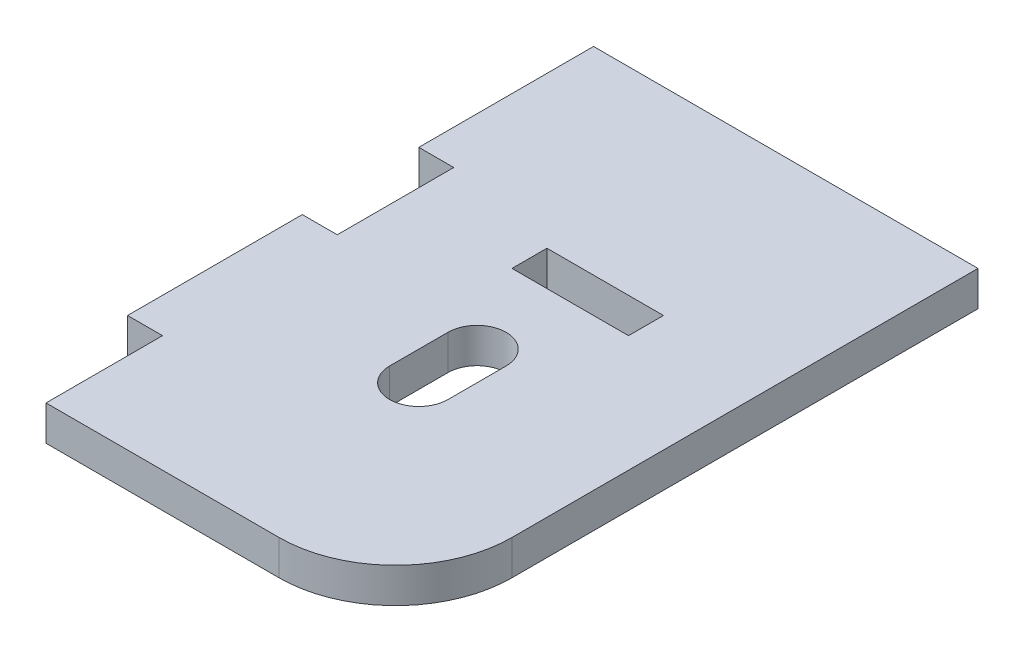
ISO-10303-21;
HEADER;
FILE_DESCRIPTION(('STEP AP214'),'2;1');
FILE_NAME('part.step','',(''),(''),'','','');
FILE_SCHEMA(('AUTOMOTIVE_DESIGN { 1 0 10303 214 1 1 1 1 }'));
ENDSEC;
DATA;
#1=APPLICATION_CONTEXT('core data for automotive mechanical design processes');
#2=APPLICATION_PROTOCOL_DEFINITION('international standard','automotive_design',2000,#1);
#3=PRODUCT_CONTEXT('',#1,'mechanical');
#4=PRODUCT('Part','Part','',(#3));
#5=PRODUCT_RELATED_PRODUCT_CATEGORY('part','',(#4));
#6=PRODUCT_DEFINITION_FORMATION('','',#4);
#7=PRODUCT_DEFINITION_CONTEXT('part definition',#1,'design');
#8=PRODUCT_DEFINITION('design','',#6,#7);
#9=PRODUCT_DEFINITION_SHAPE('','',#8);
#10=(LENGTH_UNIT() NAMED_UNIT(*) SI_UNIT(.MILLI.,.METRE.));
#11=(NAMED_UNIT(*) PLANE_ANGLE_UNIT() SI_UNIT($,.RADIAN.));
#12=(NAMED_UNIT(*) SI_UNIT($,.STERADIAN.) SOLID_ANGLE_UNIT());
#13=UNCERTAINTY_MEASURE_WITH_UNIT(LENGTH_MEASURE(1.E-05),#10,'distance_accuracy_value','');
#14=(GEOMETRIC_REPRESENTATION_CONTEXT(3) GLOBAL_UNCERTAINTY_ASSIGNED_CONTEXT((#13)) GLOBAL_UNIT_ASSIGNED_CONTEXT((#10,
#11,#12)) REPRESENTATION_CONTEXT('',''));
#15=CARTESIAN_POINT('',(0.,0.,0.));
#16=DIRECTION('',(0.,0.,1.));
#17=DIRECTION('',(1.,0.,0.));
#18=AXIS2_PLACEMENT_3D('',#15,#16,#17);
#19=CARTESIAN_POINT('',(0.,3.,0.));
#20=DIRECTION('',(0.,1.,0.));
#21=DIRECTION('',(0.,0.,1.00000000000001));
#22=AXIS2_PLACEMENT_3D('',#19,#20,#21);
#23=PLANE('',#22);
#24=CARTESIAN_POINT('',(-15.5000000000001,3.,32.5));
#25=DIRECTION('',(0.,1.,0.));
#26=DIRECTION('',(0.,0.,1.00000000000001));
#27=AXIS2_PLACEMENT_3D('',#24,#25,#26);
#28=CIRCLE('',#27,2.5);
#29=CARTESIAN_POINT('',(-18.,3.,32.5));
#30=VERTEX_POINT('',#29);
#31=CARTESIAN_POINT('',(-13.,3.,32.5000000000013));
#32=VERTEX_POINT('',#31);
#33=EDGE_CURVE('E170',#30,#32,#28,.T.);
#34=ORIENTED_EDGE('',*,*,#33,.F.);
#35=DIRECTION('',(0.,0.,1.00000000000001));
#36=VECTOR('',#35,1.);
#37=CARTESIAN_POINT('',(-18.,3.,32.5));
#38=LINE('',#37,#36);
#39=CARTESIAN_POINT('',(-18.,3.,27.4999999999999));
#40=VERTEX_POINT('',#39);
#41=EDGE_CURVE('E187',#40,#30,#38,.T.);
#42=ORIENTED_EDGE('',*,*,#41,.F.);
#43=CARTESIAN_POINT('',(-15.5000000000001,3.,27.4999999999999));
#44=DIRECTION('',(0.,1.,0.));
#45=DIRECTION('',(0.,0.,1.00000000000001));
#46=AXIS2_PLACEMENT_3D('',#43,#44,#45);
#47=CIRCLE('',#46,2.5);
#48=CARTESIAN_POINT('',(-13.,3.,27.500000000001));
#49=VERTEX_POINT('',#48);
#50=EDGE_CURVE('E190',#49,#40,#47,.T.);
#51=ORIENTED_EDGE('',*,*,#50,.F.);
#52=DIRECTION('',(0.,0.,-1.00000000000001));
#53=VECTOR('',#52,1.);
#54=CARTESIAN_POINT('',(-13.,3.,32.5000000000013));
#55=LINE('',#54,#53);
#56=EDGE_CURVE('E196',#32,#49,#55,.T.);
#57=ORIENTED_EDGE('',*,*,#56,.F.);
#58=EDGE_LOOP('',(#34,#42,#51,#57));
#59=FACE_BOUND('',#58,.T.);
#60=DIRECTION('',(1.00000000000001,0.,0.));
#61=VECTOR('',#60,1.);
#62=CARTESIAN_POINT('',(-30.0000000000003,3.,50.0000000000005));
#63=LINE('',#62,#61);
#64=CARTESIAN_POINT('',(-30.0000000000003,3.,50.0000000000005));
#65=VERTEX_POINT('',#64);
#66=CARTESIAN_POINT('',(-10.,3.,50.0000000000012));
#67=VERTEX_POINT('',#66);
#68=EDGE_CURVE('E255',#65,#67,#63,.T.);
#69=ORIENTED_EDGE('',*,*,#68,.T.);
#70=CARTESIAN_POINT('',(-10.,3.,40.0000000000012));
#71=DIRECTION('',(0.,1.,0.));
#72=DIRECTION('',(0.,0.,1.00000000000001));
#73=AXIS2_PLACEMENT_3D('',#70,#71,#72);
#74=CIRCLE('',#73,10.);
#75=CARTESIAN_POINT('',(0.,3.,40.0000000000001));
#76=VERTEX_POINT('',#75);
#77=EDGE_CURVE('E11',#67,#76,#74,.T.);
#78=ORIENTED_EDGE('',*,*,#77,.T.);
#79=DIRECTION('',(0.,0.,-1.00000000000001));
#80=VECTOR('',#79,1.);
#81=CARTESIAN_POINT('',(0.,3.,50.0000000000001));
#82=LINE('',#81,#80);
#83=CARTESIAN_POINT('',(0.,3.,0.));
#84=VERTEX_POINT('',#83);
#85=EDGE_CURVE('E257',#76,#84,#82,.T.);
#86=ORIENTED_EDGE('',*,*,#85,.T.);
#87=DIRECTION('',(-1.00000000000001,0.,0.));
#88=VECTOR('',#87,1.);
#89=CARTESIAN_POINT('',(0.,3.,0.));
#90=LINE('',#89,#88);
#91=CARTESIAN_POINT('',(-33.0000000000002,3.,0.));
#92=VERTEX_POINT('',#91);
#93=EDGE_CURVE('E237',#84,#92,#90,.T.);
#94=ORIENTED_EDGE('',*,*,#93,.T.);
#95=DIRECTION('',(0.,0.,1.00000000000001));
#96=VECTOR('',#95,1.);
#97=CARTESIAN_POINT('',(-33.0000000000002,3.,0.));
#98=LINE('',#97,#96);
#99=CARTESIAN_POINT('',(-33.0000000000003,3.,15.0000000000002));
#100=VERTEX_POINT('',#99);
#101=EDGE_CURVE('E240',#92,#100,#98,.T.);
#102=ORIENTED_EDGE('',*,*,#101,.T.);
#103=DIRECTION('',(1.00000000000001,0.,0.));
#104=VECTOR('',#103,1.);
#105=CARTESIAN_POINT('',(-33.0000000000003,3.,15.0000000000002));
#106=LINE('',#105,#104);
#107=CARTESIAN_POINT('',(-30.0000000000003,3.,15.0000000000001));
#108=VERTEX_POINT('',#107);
#109=EDGE_CURVE('E243',#100,#108,#106,.T.);
#110=ORIENTED_EDGE('',*,*,#109,.T.);
#111=DIRECTION('',(0.,0.,1.00000000000001));
#112=VECTOR('',#111,1.);
#113=CARTESIAN_POINT('',(-30.0000000000003,3.,15.0000000000001));
#114=LINE('',#113,#112);
#115=CARTESIAN_POINT('',(-30.0000000000003,3.,25.0000000000001));
#116=VERTEX_POINT('',#115);
#117=EDGE_CURVE('E245',#108,#116,#114,.T.);
#118=ORIENTED_EDGE('',*,*,#117,.T.);
#119=DIRECTION('',(-1.00000000000001,0.,0.));
#120=VECTOR('',#119,1.);
#121=CARTESIAN_POINT('',(-30.0000000000003,3.,25.0000000000001));
#122=LINE('',#121,#120);
#123=CARTESIAN_POINT('',(-33.0000000000003,3.,25.0000000000002));
#124=VERTEX_POINT('',#123);
#125=EDGE_CURVE('E247',#116,#124,#122,.T.);
#126=ORIENTED_EDGE('',*,*,#125,.T.);
#127=DIRECTION('',(0.,0.,1.00000000000001));
#128=VECTOR('',#127,1.);
#129=CARTESIAN_POINT('',(-33.0000000000003,3.,25.0000000000002));
#130=LINE('',#129,#128);
#131=CARTESIAN_POINT('',(-33.0000000000001,3.,40.0000000000005));
#132=VERTEX_POINT('',#131);
#133=EDGE_CURVE('E249',#124,#132,#130,.T.);
#134=ORIENTED_EDGE('',*,*,#133,.T.);
#135=DIRECTION('',(1.00000000000001,0.,0.));
#136=VECTOR('',#135,1.);
#137=CARTESIAN_POINT('',(-33.0000000000001,3.,40.0000000000005));
#138=LINE('',#137,#136);
#139=CARTESIAN_POINT('',(-30.0000000000001,3.,40.0000000000005));
#140=VERTEX_POINT('',#139);
#141=EDGE_CURVE('E251',#132,#140,#138,.T.);
#142=ORIENTED_EDGE('',*,*,#141,.T.);
#143=DIRECTION('',(0.,0.,1.00000000000001));
#144=VECTOR('',#143,1.);
#145=CARTESIAN_POINT('',(-30.0000000000001,3.,40.0000000000005));
#146=LINE('',#145,#144);
#147=EDGE_CURVE('E253',#140,#65,#146,.T.);
#148=ORIENTED_EDGE('',*,*,#147,.T.);
#149=EDGE_LOOP('',(#69,#78,#86,#94,#102,#110,#118,#126,#134,#142,#148));
#150=FACE_BOUND('',#149,.T.);
#151=DIRECTION('',(1.00000000000001,0.,0.));
#152=VECTOR('',#151,1.);
#153=CARTESIAN_POINT('',(-20.,3.,20.0000000000001));
#154=LINE('',#153,#152);
#155=CARTESIAN_POINT('',(-20.,3.,20.0000000000001));
#156=VERTEX_POINT('',#155);
#157=CARTESIAN_POINT('',(-10.,3.,20.0000000000012));
#158=VERTEX_POINT('',#157);
#159=EDGE_CURVE('E208',#156,#158,#154,.T.);
#160=ORIENTED_EDGE('',*,*,#159,.F.);
#161=DIRECTION('',(0.,0.,1.00000000000001));
#162=VECTOR('',#161,1.);
#163=CARTESIAN_POINT('',(-20.,3.,17.));
#164=LINE('',#163,#162);
#165=CARTESIAN_POINT('',(-20.,3.,17.));
#166=VERTEX_POINT('',#165);
#167=EDGE_CURVE('E206',#166,#156,#164,.T.);
#168=ORIENTED_EDGE('',*,*,#167,.F.);
#169=DIRECTION('',(-1.00000000000001,0.,0.));
#170=VECTOR('',#169,1.);
#171=CARTESIAN_POINT('',(-20.,3.,17.));
#172=LINE('',#171,#170);
#173=CARTESIAN_POINT('',(-10.,3.,17.0000000000013));
#174=VERTEX_POINT('',#173);
#175=EDGE_CURVE('E214',#174,#166,#172,.T.);
#176=ORIENTED_EDGE('',*,*,#175,.F.);
#177=DIRECTION('',(0.,0.,-1.00000000000001));
#178=VECTOR('',#177,1.);
#179=CARTESIAN_POINT('',(-10.,3.,17.0000000000013));
#180=LINE('',#179,#178);
#181=EDGE_CURVE('E211',#158,#174,#180,.T.);
#182=ORIENTED_EDGE('',*,*,#181,.F.);
#183=EDGE_LOOP('',(#160,#168,#176,#182));
#184=FACE_BOUND('',#183,.T.);
#185=ADVANCED_FACE('F32',(#59,#150,#184),#23,.T.);
#186=CARTESIAN_POINT('',(0.,0.,0.));
#187=DIRECTION('',(0.,1.,0.));
#188=DIRECTION('',(0.,0.,1.00000000000001));
#189=AXIS2_PLACEMENT_3D('',#186,#187,#188);
#190=PLANE('',#189);
#191=DIRECTION('',(0.,0.,1.00000000000001));
#192=VECTOR('',#191,1.);
#193=CARTESIAN_POINT('',(-18.,0.,32.5));
#194=LINE('',#193,#192);
#195=CARTESIAN_POINT('',(-18.,0.,27.4999999999999));
#196=VERTEX_POINT('',#195);
#197=CARTESIAN_POINT('',(-18.,0.,32.5));
#198=VERTEX_POINT('',#197);
#199=EDGE_CURVE('E175',#196,#198,#194,.T.);
#200=ORIENTED_EDGE('',*,*,#199,.T.);
#201=CARTESIAN_POINT('',(-15.5000000000001,0.,32.5));
#202=DIRECTION('',(0.,1.,0.));
#203=DIRECTION('',(0.,0.,1.00000000000001));
#204=AXIS2_PLACEMENT_3D('',#201,#202,#203);
#205=CIRCLE('',#204,2.5);
#206=CARTESIAN_POINT('',(-13.,0.,32.5000000000013));
#207=VERTEX_POINT('',#206);
#208=EDGE_CURVE('E167',#198,#207,#205,.T.);
#209=ORIENTED_EDGE('',*,*,#208,.T.);
#210=DIRECTION('',(0.,0.,-1.00000000000001));
#211=VECTOR('',#210,1.);
#212=CARTESIAN_POINT('',(-13.,0.,32.5000000000013));
#213=LINE('',#212,#211);
#214=CARTESIAN_POINT('',(-13.,0.,27.500000000001));
#215=VERTEX_POINT('',#214);
#216=EDGE_CURVE('E179',#207,#215,#213,.T.);
#217=ORIENTED_EDGE('',*,*,#216,.T.);
#218=CARTESIAN_POINT('',(-15.5000000000001,0.,27.4999999999999));
#219=DIRECTION('',(0.,1.,0.));
#220=DIRECTION('',(0.,0.,1.00000000000001));
#221=AXIS2_PLACEMENT_3D('',#218,#219,#220);
#222=CIRCLE('',#221,2.5);
#223=EDGE_CURVE('E183',#215,#196,#222,.T.);
#224=ORIENTED_EDGE('',*,*,#223,.T.);
#225=EDGE_LOOP('',(#200,#209,#217,#224));
#226=FACE_BOUND('',#225,.T.);
#227=DIRECTION('',(0.,0.,-1.00000000000001));
#228=VECTOR('',#227,1.);
#229=CARTESIAN_POINT('',(0.,0.,50.0000000000001));
#230=LINE('',#229,#228);
#231=CARTESIAN_POINT('',(0.,0.,40.0000000000001));
#232=VERTEX_POINT('',#231);
#233=CARTESIAN_POINT('',(0.,0.,0.));
#234=VERTEX_POINT('',#233);
#235=EDGE_CURVE('E241',#232,#234,#230,.T.);
#236=ORIENTED_EDGE('',*,*,#235,.F.);
#237=CARTESIAN_POINT('',(-10.,0.,40.0000000000012));
#238=DIRECTION('',(0.,1.,0.));
#239=DIRECTION('',(0.,0.,1.00000000000001));
#240=AXIS2_PLACEMENT_3D('',#237,#238,#239);
#241=CIRCLE('',#240,10.);
#242=CARTESIAN_POINT('',(-10.,0.,50.0000000000012));
#243=VERTEX_POINT('',#242);
#244=EDGE_CURVE('E54',#232,#243,#241,.F.);
#245=ORIENTED_EDGE('',*,*,#244,.T.);
#246=DIRECTION('',(1.00000000000001,0.,0.));
#247=VECTOR('',#246,1.);
#248=CARTESIAN_POINT('',(-30.0000000000003,0.,50.0000000000005));
#249=LINE('',#248,#247);
#250=CARTESIAN_POINT('',(-30.0000000000003,0.,50.0000000000005));
#251=VERTEX_POINT('',#250);
#252=EDGE_CURVE('E276',#251,#243,#249,.T.);
#253=ORIENTED_EDGE('',*,*,#252,.F.);
#254=DIRECTION('',(0.,0.,1.00000000000001));
#255=VECTOR('',#254,1.);
#256=CARTESIAN_POINT('',(-30.0000000000001,0.,40.0000000000005));
#257=LINE('',#256,#255);
#258=CARTESIAN_POINT('',(-30.0000000000001,0.,40.0000000000005));
#259=VERTEX_POINT('',#258);
#260=EDGE_CURVE('E274',#259,#251,#257,.T.);
#261=ORIENTED_EDGE('',*,*,#260,.F.);
#262=DIRECTION('',(1.00000000000001,0.,0.));
#263=VECTOR('',#262,1.);
#264=CARTESIAN_POINT('',(-33.0000000000001,0.,40.0000000000005));
#265=LINE('',#264,#263);
#266=CARTESIAN_POINT('',(-33.0000000000001,0.,40.0000000000005));
#267=VERTEX_POINT('',#266);
#268=EDGE_CURVE('E272',#267,#259,#265,.T.);
#269=ORIENTED_EDGE('',*,*,#268,.F.);
#270=DIRECTION('',(0.,0.,1.00000000000001));
#271=VECTOR('',#270,1.);
#272=CARTESIAN_POINT('',(-33.0000000000003,0.,25.0000000000002));
#273=LINE('',#272,#271);
#274=CARTESIAN_POINT('',(-33.0000000000003,0.,25.0000000000002));
#275=VERTEX_POINT('',#274);
#276=EDGE_CURVE('E270',#275,#267,#273,.T.);
#277=ORIENTED_EDGE('',*,*,#276,.F.);
#278=DIRECTION('',(-1.00000000000001,0.,0.));
#279=VECTOR('',#278,1.);
#280=CARTESIAN_POINT('',(-30.0000000000003,0.,25.0000000000001));
#281=LINE('',#280,#279);
#282=CARTESIAN_POINT('',(-30.0000000000003,0.,25.0000000000001));
#283=VERTEX_POINT('',#282);
#284=EDGE_CURVE('E268',#283,#275,#281,.T.);
#285=ORIENTED_EDGE('',*,*,#284,.F.);
#286=DIRECTION('',(0.,0.,1.00000000000001));
#287=VECTOR('',#286,1.);
#288=CARTESIAN_POINT('',(-30.0000000000003,0.,15.0000000000001));
#289=LINE('',#288,#287);
#290=CARTESIAN_POINT('',(-30.0000000000003,0.,15.0000000000001));
#291=VERTEX_POINT('',#290);
#292=EDGE_CURVE('E266',#291,#283,#289,.T.);
#293=ORIENTED_EDGE('',*,*,#292,.F.);
#294=DIRECTION('',(1.00000000000001,0.,0.));
#295=VECTOR('',#294,1.);
#296=CARTESIAN_POINT('',(-33.0000000000003,0.,15.0000000000002));
#297=LINE('',#296,#295);
#298=CARTESIAN_POINT('',(-33.0000000000003,0.,15.0000000000002));
#299=VERTEX_POINT('',#298);
#300=EDGE_CURVE('E264',#299,#291,#297,.T.);
#301=ORIENTED_EDGE('',*,*,#300,.F.);
#302=DIRECTION('',(0.,0.,1.00000000000001));
#303=VECTOR('',#302,1.);
#304=CARTESIAN_POINT('',(-33.0000000000002,0.,0.));
#305=LINE('',#304,#303);
#306=CARTESIAN_POINT('',(-33.0000000000002,0.,0.));
#307=VERTEX_POINT('',#306);
#308=EDGE_CURVE('E262',#307,#299,#305,.T.);
#309=ORIENTED_EDGE('',*,*,#308,.F.);
#310=DIRECTION('',(-1.00000000000001,0.,0.));
#311=VECTOR('',#310,1.);
#312=CARTESIAN_POINT('',(0.,0.,0.));
#313=LINE('',#312,#311);
#314=EDGE_CURVE('E236',#234,#307,#313,.T.);
#315=ORIENTED_EDGE('',*,*,#314,.F.);
#316=EDGE_LOOP('',(#236,#245,#253,#261,#269,#277,#285,#293,#301,#309,#315));
#317=FACE_BOUND('',#316,.T.);
#318=DIRECTION('',(0.,0.,1.00000000000001));
#319=VECTOR('',#318,1.);
#320=CARTESIAN_POINT('',(-20.,0.,17.));
#321=LINE('',#320,#319);
#322=CARTESIAN_POINT('',(-20.,0.,17.));
#323=VERTEX_POINT('',#322);
#324=CARTESIAN_POINT('',(-20.,0.,20.0000000000001));
#325=VERTEX_POINT('',#324);
#326=EDGE_CURVE('E202',#323,#325,#321,.T.);
#327=ORIENTED_EDGE('',*,*,#326,.T.);
#328=DIRECTION('',(1.00000000000001,0.,0.));
#329=VECTOR('',#328,1.);
#330=CARTESIAN_POINT('',(-20.,0.,20.0000000000001));
#331=LINE('',#330,#329);
#332=CARTESIAN_POINT('',(-10.,0.,20.0000000000012));
#333=VERTEX_POINT('',#332);
#334=EDGE_CURVE('E219',#325,#333,#331,.T.);
#335=ORIENTED_EDGE('',*,*,#334,.T.);
#336=DIRECTION('',(0.,0.,-1.00000000000001));
#337=VECTOR('',#336,1.);
#338=CARTESIAN_POINT('',(-10.,0.,17.0000000000013));
#339=LINE('',#338,#337);
#340=CARTESIAN_POINT('',(-10.,0.,17.0000000000013));
#341=VERTEX_POINT('',#340);
#342=EDGE_CURVE('E222',#333,#341,#339,.T.);
#343=ORIENTED_EDGE('',*,*,#342,.T.);
#344=DIRECTION('',(-1.00000000000001,0.,0.));
#345=VECTOR('',#344,1.);
#346=CARTESIAN_POINT('',(-20.,0.,17.));
#347=LINE('',#346,#345);
#348=EDGE_CURVE('E209',#341,#323,#347,.T.);
#349=ORIENTED_EDGE('',*,*,#348,.T.);
#350=EDGE_LOOP('',(#327,#335,#343,#349));
#351=FACE_BOUND('',#350,.T.);
#352=ADVANCED_FACE('F185',(#226,#317,#351),#190,.F.);
#353=CARTESIAN_POINT('',(0.,3.,0.));
#354=DIRECTION('',(0.,0.,1.00000000000001));
#355=DIRECTION('',(1.00000000000001,0.,0.));
#356=AXIS2_PLACEMENT_3D('',#353,#354,#355);
#357=PLANE('',#356);
#358=ORIENTED_EDGE('',*,*,#314,.T.);
#359=DIRECTION('',(0.,-1.,0.));
#360=VECTOR('',#359,1.);
#361=CARTESIAN_POINT('',(-33.0000000000002,3.,0.));
#362=LINE('',#361,#360);
#363=EDGE_CURVE('E302',#92,#307,#362,.T.);
#364=ORIENTED_EDGE('',*,*,#363,.F.);
#365=ORIENTED_EDGE('',*,*,#93,.F.);
#366=DIRECTION('',(0.,-1.,0.));
#367=VECTOR('',#366,1.);
#368=CARTESIAN_POINT('',(0.,3.,0.));
#369=LINE('',#368,#367);
#370=EDGE_CURVE('E259',#84,#234,#369,.T.);
#371=ORIENTED_EDGE('',*,*,#370,.T.);
#372=EDGE_LOOP('',(#358,#364,#365,#371));
#373=FACE_BOUND('',#372,.T.);
#374=ADVANCED_FACE('F320',(#373),#357,.F.);
#375=CARTESIAN_POINT('',(-33.0000000000002,3.,0.));
#376=DIRECTION('',(1.00000000000001,0.,0.));
#377=DIRECTION('',(0.,0.,-1.00000000000001));
#378=AXIS2_PLACEMENT_3D('',#375,#376,#377);
#379=PLANE('',#378);
#380=ORIENTED_EDGE('',*,*,#308,.T.);
#381=DIRECTION('',(0.,-1.,0.));
#382=VECTOR('',#381,1.);
#383=CARTESIAN_POINT('',(-33.0000000000003,3.,15.0000000000002));
#384=LINE('',#383,#382);
#385=EDGE_CURVE('E299',#100,#299,#384,.T.);
#386=ORIENTED_EDGE('',*,*,#385,.F.);
#387=ORIENTED_EDGE('',*,*,#101,.F.);
#388=ORIENTED_EDGE('',*,*,#363,.T.);
#389=EDGE_LOOP('',(#380,#386,#387,#388));
#390=FACE_BOUND('',#389,.T.);
#391=ADVANCED_FACE('F370',(#390),#379,.F.);
#392=CARTESIAN_POINT('',(-33.0000000000003,3.,15.0000000000002));
#393=DIRECTION('',(0.,0.,-1.00000000000001));
#394=DIRECTION('',(-1.00000000000001,0.,0.));
#395=AXIS2_PLACEMENT_3D('',#392,#393,#394);
#396=PLANE('',#395);
#397=ORIENTED_EDGE('',*,*,#300,.T.);
#398=DIRECTION('',(0.,-1.,0.));
#399=VECTOR('',#398,1.);
#400=CARTESIAN_POINT('',(-30.0000000000003,3.,15.0000000000001));
#401=LINE('',#400,#399);
#402=EDGE_CURVE('E296',#108,#291,#401,.T.);
#403=ORIENTED_EDGE('',*,*,#402,.F.);
#404=ORIENTED_EDGE('',*,*,#109,.F.);
#405=ORIENTED_EDGE('',*,*,#385,.T.);
#406=EDGE_LOOP('',(#397,#403,#404,#405));
#407=FACE_BOUND('',#406,.T.);
#408=ADVANCED_FACE('F366',(#407),#396,.F.);
#409=CARTESIAN_POINT('',(-30.0000000000003,3.,15.0000000000001));
#410=DIRECTION('',(1.00000000000001,0.,0.));
#411=DIRECTION('',(0.,0.,-1.00000000000001));
#412=AXIS2_PLACEMENT_3D('',#409,#410,#411);
#413=PLANE('',#412);
#414=ORIENTED_EDGE('',*,*,#292,.T.);
#415=DIRECTION('',(0.,-1.,0.));
#416=VECTOR('',#415,1.);
#417=CARTESIAN_POINT('',(-30.0000000000003,3.,25.0000000000001));
#418=LINE('',#417,#416);
#419=EDGE_CURVE('E293',#116,#283,#418,.T.);
#420=ORIENTED_EDGE('',*,*,#419,.F.);
#421=ORIENTED_EDGE('',*,*,#117,.F.);
#422=ORIENTED_EDGE('',*,*,#402,.T.);
#423=EDGE_LOOP('',(#414,#420,#421,#422));
#424=FACE_BOUND('',#423,.T.);
#425=ADVANCED_FACE('F362',(#424),#413,.F.);
#426=CARTESIAN_POINT('',(-30.0000000000003,3.,25.0000000000001));
#427=DIRECTION('',(0.,0.,1.00000000000001));
#428=DIRECTION('',(1.00000000000001,0.,0.));
#429=AXIS2_PLACEMENT_3D('',#426,#427,#428);
#430=PLANE('',#429);
#431=ORIENTED_EDGE('',*,*,#284,.T.);
#432=DIRECTION('',(0.,-1.,0.));
#433=VECTOR('',#432,1.);
#434=CARTESIAN_POINT('',(-33.0000000000003,3.,25.0000000000002));
#435=LINE('',#434,#433);
#436=EDGE_CURVE('E290',#124,#275,#435,.T.);
#437=ORIENTED_EDGE('',*,*,#436,.F.);
#438=ORIENTED_EDGE('',*,*,#125,.F.);
#439=ORIENTED_EDGE('',*,*,#419,.T.);
#440=EDGE_LOOP('',(#431,#437,#438,#439));
#441=FACE_BOUND('',#440,.T.);
#442=ADVANCED_FACE('F358',(#441),#430,.F.);
#443=CARTESIAN_POINT('',(-33.0000000000003,3.,25.0000000000002));
#444=DIRECTION('',(1.00000000000001,0.,0.));
#445=DIRECTION('',(0.,0.,-1.00000000000001));
#446=AXIS2_PLACEMENT_3D('',#443,#444,#445);
#447=PLANE('',#446);
#448=ORIENTED_EDGE('',*,*,#276,.T.);
#449=DIRECTION('',(0.,-1.,0.));
#450=VECTOR('',#449,1.);
#451=CARTESIAN_POINT('',(-33.0000000000001,3.,40.0000000000005));
#452=LINE('',#451,#450);
#453=EDGE_CURVE('E287',#132,#267,#452,.T.);
#454=ORIENTED_EDGE('',*,*,#453,.F.);
#455=ORIENTED_EDGE('',*,*,#133,.F.);
#456=ORIENTED_EDGE('',*,*,#436,.T.);
#457=EDGE_LOOP('',(#448,#454,#455,#456));
#458=FACE_BOUND('',#457,.T.);
#459=ADVANCED_FACE('F354',(#458),#447,.F.);
#460=CARTESIAN_POINT('',(-33.0000000000001,3.,40.0000000000005));
#461=DIRECTION('',(0.,0.,-1.00000000000001));
#462=DIRECTION('',(-1.00000000000001,0.,0.));
#463=AXIS2_PLACEMENT_3D('',#460,#461,#462);
#464=PLANE('',#463);
#465=ORIENTED_EDGE('',*,*,#268,.T.);
#466=DIRECTION('',(0.,-1.,0.));
#467=VECTOR('',#466,1.);
#468=CARTESIAN_POINT('',(-30.0000000000001,3.,40.0000000000005));
#469=LINE('',#468,#467);
#470=EDGE_CURVE('E284',#140,#259,#469,.T.);
#471=ORIENTED_EDGE('',*,*,#470,.F.);
#472=ORIENTED_EDGE('',*,*,#141,.F.);
#473=ORIENTED_EDGE('',*,*,#453,.T.);
#474=EDGE_LOOP('',(#465,#471,#472,#473));
#475=FACE_BOUND('',#474,.T.);
#476=ADVANCED_FACE('F350',(#475),#464,.F.);
#477=CARTESIAN_POINT('',(-30.0000000000001,3.,40.0000000000005));
#478=DIRECTION('',(1.00000000000001,0.,0.));
#479=DIRECTION('',(0.,0.,-1.00000000000001));
#480=AXIS2_PLACEMENT_3D('',#477,#478,#479);
#481=PLANE('',#480);
#482=ORIENTED_EDGE('',*,*,#260,.T.);
#483=DIRECTION('',(0.,-1.,0.));
#484=VECTOR('',#483,1.);
#485=CARTESIAN_POINT('',(-30.0000000000003,3.,50.0000000000005));
#486=LINE('',#485,#484);
#487=EDGE_CURVE('E281',#65,#251,#486,.T.);
#488=ORIENTED_EDGE('',*,*,#487,.F.);
#489=ORIENTED_EDGE('',*,*,#147,.F.);
#490=ORIENTED_EDGE('',*,*,#470,.T.);
#491=EDGE_LOOP('',(#482,#488,#489,#490));
#492=FACE_BOUND('',#491,.T.);
#493=ADVANCED_FACE('F347',(#492),#481,.F.);
#494=CARTESIAN_POINT('',(-30.0000000000003,3.,50.0000000000005));
#495=DIRECTION('',(0.,0.,-1.00000000000001));
#496=DIRECTION('',(-1.00000000000001,0.,0.));
#497=AXIS2_PLACEMENT_3D('',#494,#495,#496);
#498=PLANE('',#497);
#499=ORIENTED_EDGE('',*,*,#252,.T.);
#500=DIRECTION('',(0.,-1.,0.));
#501=VECTOR('',#500,1.);
#502=CARTESIAN_POINT('',(-10.,3.,50.0000000000012));
#503=LINE('',#502,#501);
#504=EDGE_CURVE('E40',#243,#67,#503,.F.);
#505=ORIENTED_EDGE('',*,*,#504,.T.);
#506=ORIENTED_EDGE('',*,*,#68,.F.);
#507=ORIENTED_EDGE('',*,*,#487,.T.);
#508=EDGE_LOOP('',(#499,#505,#506,#507));
#509=FACE_BOUND('',#508,.T.);
#510=ADVANCED_FACE('F344',(#509),#498,.F.);
#511=CARTESIAN_POINT('',(0.,3.,50.0000000000001));
#512=DIRECTION('',(-1.00000000000001,0.,0.));
#513=DIRECTION('',(0.,0.,1.00000000000001));
#514=AXIS2_PLACEMENT_3D('',#511,#512,#513);
#515=PLANE('',#514);
#516=ORIENTED_EDGE('',*,*,#85,.F.);
#517=DIRECTION('',(0.,-1.,0.));
#518=VECTOR('',#517,1.);
#519=CARTESIAN_POINT('',(0.,3.,40.0000000000001));
#520=LINE('',#519,#518);
#521=EDGE_CURVE('E305',#76,#232,#520,.T.);
#522=ORIENTED_EDGE('',*,*,#521,.T.);
#523=ORIENTED_EDGE('',*,*,#235,.T.);
#524=ORIENTED_EDGE('',*,*,#370,.F.);
#525=EDGE_LOOP('',(#516,#522,#523,#524));
#526=FACE_BOUND('',#525,.T.);
#527=ADVANCED_FACE('F311',(#526),#515,.F.);
#528=CARTESIAN_POINT('',(-20.,3.,17.));
#529=DIRECTION('',(1.00000000000001,0.,0.));
#530=DIRECTION('',(0.,0.,-1.00000000000001));
#531=AXIS2_PLACEMENT_3D('',#528,#529,#530);
#532=PLANE('',#531);
#533=ORIENTED_EDGE('',*,*,#326,.F.);
#534=DIRECTION('',(0.,-1.,0.));
#535=VECTOR('',#534,1.);
#536=CARTESIAN_POINT('',(-20.,3.,17.));
#537=LINE('',#536,#535);
#538=EDGE_CURVE('E216',#166,#323,#537,.T.);
#539=ORIENTED_EDGE('',*,*,#538,.F.);
#540=ORIENTED_EDGE('',*,*,#167,.T.);
#541=DIRECTION('',(0.,-1.,0.));
#542=VECTOR('',#541,1.);
#543=CARTESIAN_POINT('',(-20.,3.,20.0000000000001));
#544=LINE('',#543,#542);
#545=EDGE_CURVE('E233',#156,#325,#544,.T.);
#546=ORIENTED_EDGE('',*,*,#545,.T.);
#547=EDGE_LOOP('',(#533,#539,#540,#546));
#548=FACE_BOUND('',#547,.T.);
#549=ADVANCED_FACE('F339',(#548),#532,.T.);
#550=CARTESIAN_POINT('',(-20.,3.,20.0000000000001));
#551=DIRECTION('',(0.,0.,-1.00000000000001));
#552=DIRECTION('',(-1.00000000000001,0.,0.));
#553=AXIS2_PLACEMENT_3D('',#550,#551,#552);
#554=PLANE('',#553);
#555=ORIENTED_EDGE('',*,*,#334,.F.);
#556=ORIENTED_EDGE('',*,*,#545,.F.);
#557=ORIENTED_EDGE('',*,*,#159,.T.);
#558=DIRECTION('',(0.,-1.,0.));
#559=VECTOR('',#558,1.);
#560=CARTESIAN_POINT('',(-10.,3.,20.0000000000012));
#561=LINE('',#560,#559);
#562=EDGE_CURVE('E231',#158,#333,#561,.T.);
#563=ORIENTED_EDGE('',*,*,#562,.T.);
#564=EDGE_LOOP('',(#555,#556,#557,#563));
#565=FACE_BOUND('',#564,.T.);
#566=ADVANCED_FACE('F421',(#565),#554,.T.);
#567=CARTESIAN_POINT('',(-10.,3.,17.0000000000013));
#568=DIRECTION('',(-1.00000000000001,0.,0.));
#569=DIRECTION('',(0.,0.,1.00000000000001));
#570=AXIS2_PLACEMENT_3D('',#567,#568,#569);
#571=PLANE('',#570);
#572=ORIENTED_EDGE('',*,*,#342,.F.);
#573=ORIENTED_EDGE('',*,*,#562,.F.);
#574=ORIENTED_EDGE('',*,*,#181,.T.);
#575=DIRECTION('',(0.,-1.,0.));
#576=VECTOR('',#575,1.);
#577=CARTESIAN_POINT('',(-10.,3.,17.0000000000013));
#578=LINE('',#577,#576);
#579=EDGE_CURVE('E229',#174,#341,#578,.T.);
#580=ORIENTED_EDGE('',*,*,#579,.T.);
#581=EDGE_LOOP('',(#572,#573,#574,#580));
#582=FACE_BOUND('',#581,.T.);
#583=ADVANCED_FACE('F428',(#582),#571,.T.);
#584=CARTESIAN_POINT('',(-20.,3.,17.));
#585=DIRECTION('',(0.,0.,1.00000000000001));
#586=DIRECTION('',(1.00000000000001,0.,0.));
#587=AXIS2_PLACEMENT_3D('',#584,#585,#586);
#588=PLANE('',#587);
#589=ORIENTED_EDGE('',*,*,#348,.F.);
#590=ORIENTED_EDGE('',*,*,#579,.F.);
#591=ORIENTED_EDGE('',*,*,#175,.T.);
#592=ORIENTED_EDGE('',*,*,#538,.T.);
#593=EDGE_LOOP('',(#589,#590,#591,#592));
#594=FACE_BOUND('',#593,.T.);
#595=ADVANCED_FACE('F435',(#594),#588,.T.);
#596=CARTESIAN_POINT('',(-15.5000000000001,0.,32.5));
#597=DIRECTION('',(0.,1.,0.));
#598=DIRECTION('',(0.,0.,1.00000000000001));
#599=AXIS2_PLACEMENT_3D('',#596,#597,#598);
#600=CYLINDRICAL_SURFACE('',#599,2.5);
#601=ORIENTED_EDGE('',*,*,#33,.T.);
#602=DIRECTION('',(0.,1.,0.));
#603=VECTOR('',#602,1.);
#604=CARTESIAN_POINT('',(-13.,0.,32.5000000000013));
#605=LINE('',#604,#603);
#606=EDGE_CURVE('E163',#207,#32,#605,.T.);
#607=ORIENTED_EDGE('',*,*,#606,.F.);
#608=ORIENTED_EDGE('',*,*,#208,.F.);
#609=DIRECTION('',(0.,1.,0.));
#610=VECTOR('',#609,1.);
#611=CARTESIAN_POINT('',(-18.,0.,32.5));
#612=LINE('',#611,#610);
#613=EDGE_CURVE('E200',#198,#30,#612,.T.);
#614=ORIENTED_EDGE('',*,*,#613,.T.);
#615=EDGE_LOOP('',(#601,#607,#608,#614));
#616=FACE_BOUND('',#615,.T.);
#617=ADVANCED_FACE('F165',(#616),#600,.F.);
#618=CARTESIAN_POINT('',(-18.,0.,32.5));
#619=DIRECTION('',(-1.00000000000001,0.,0.));
#620=DIRECTION('',(0.,0.,1.00000000000001));
#621=AXIS2_PLACEMENT_3D('',#618,#619,#620);
#622=PLANE('',#621);
#623=ORIENTED_EDGE('',*,*,#41,.T.);
#624=ORIENTED_EDGE('',*,*,#613,.F.);
#625=ORIENTED_EDGE('',*,*,#199,.F.);
#626=DIRECTION('',(0.,1.,0.));
#627=VECTOR('',#626,1.);
#628=CARTESIAN_POINT('',(-18.,0.,27.4999999999999));
#629=LINE('',#628,#627);
#630=EDGE_CURVE('E203',#196,#40,#629,.T.);
#631=ORIENTED_EDGE('',*,*,#630,.T.);
#632=EDGE_LOOP('',(#623,#624,#625,#631));
#633=FACE_BOUND('',#632,.T.);
#634=ADVANCED_FACE('F450',(#633),#622,.F.);
#635=CARTESIAN_POINT('',(-15.5000000000001,0.,27.4999999999999));
#636=DIRECTION('',(0.,1.,0.));
#637=DIRECTION('',(0.,0.,1.00000000000001));
#638=AXIS2_PLACEMENT_3D('',#635,#636,#637);
#639=CYLINDRICAL_SURFACE('',#638,2.5);
#640=ORIENTED_EDGE('',*,*,#50,.T.);
#641=ORIENTED_EDGE('',*,*,#630,.F.);
#642=ORIENTED_EDGE('',*,*,#223,.F.);
#643=DIRECTION('',(0.,1.,0.));
#644=VECTOR('',#643,1.);
#645=CARTESIAN_POINT('',(-13.,0.,27.500000000001));
#646=LINE('',#645,#644);
#647=EDGE_CURVE('E174',#215,#49,#646,.T.);
#648=ORIENTED_EDGE('',*,*,#647,.T.);
#649=EDGE_LOOP('',(#640,#641,#642,#648));
#650=FACE_BOUND('',#649,.T.);
#651=ADVANCED_FACE('F329',(#650),#639,.F.);
#652=CARTESIAN_POINT('',(-13.,0.,32.5000000000013));
#653=DIRECTION('',(1.00000000000001,0.,0.));
#654=DIRECTION('',(0.,0.,-1.00000000000001));
#655=AXIS2_PLACEMENT_3D('',#652,#653,#654);
#656=PLANE('',#655);
#657=ORIENTED_EDGE('',*,*,#56,.T.);
#658=ORIENTED_EDGE('',*,*,#647,.F.);
#659=ORIENTED_EDGE('',*,*,#216,.F.);
#660=ORIENTED_EDGE('',*,*,#606,.T.);
#661=EDGE_LOOP('',(#657,#658,#659,#660));
#662=FACE_BOUND('',#661,.T.);
#663=ADVANCED_FACE('F180',(#662),#656,.F.);
#664=CARTESIAN_POINT('',(-10.,3.,40.0000000000012));
#665=DIRECTION('',(0.,-1.,0.));
#666=DIRECTION('',(0.,0.,-1.00000000000001));
#667=AXIS2_PLACEMENT_3D('',#664,#665,#666);
#668=CYLINDRICAL_SURFACE('',#667,10.);
#669=ORIENTED_EDGE('',*,*,#77,.F.);
#670=ORIENTED_EDGE('',*,*,#504,.F.);
#671=ORIENTED_EDGE('',*,*,#244,.F.);
#672=ORIENTED_EDGE('',*,*,#521,.F.);
#673=EDGE_LOOP('',(#669,#670,#671,#672));
#674=FACE_BOUND('',#673,.T.);
#675=ADVANCED_FACE('F34',(#674),#668,.T.);
#676=CLOSED_SHELL('',(#185,#352,#374,#391,#408,#425,#442,#459,#476,#493,#510,#527,#549,#566,
#583,#595,#617,#634,#651,#663,#675));
#677=MANIFOLD_SOLID_BREP('B2',#676);
#678=ADVANCED_BREP_SHAPE_REPRESENTATION('',(#18,#677),#14);
#679=SHAPE_DEFINITION_REPRESENTATION(#9,#678);
ENDSEC;
END-ISO-10303-21;
